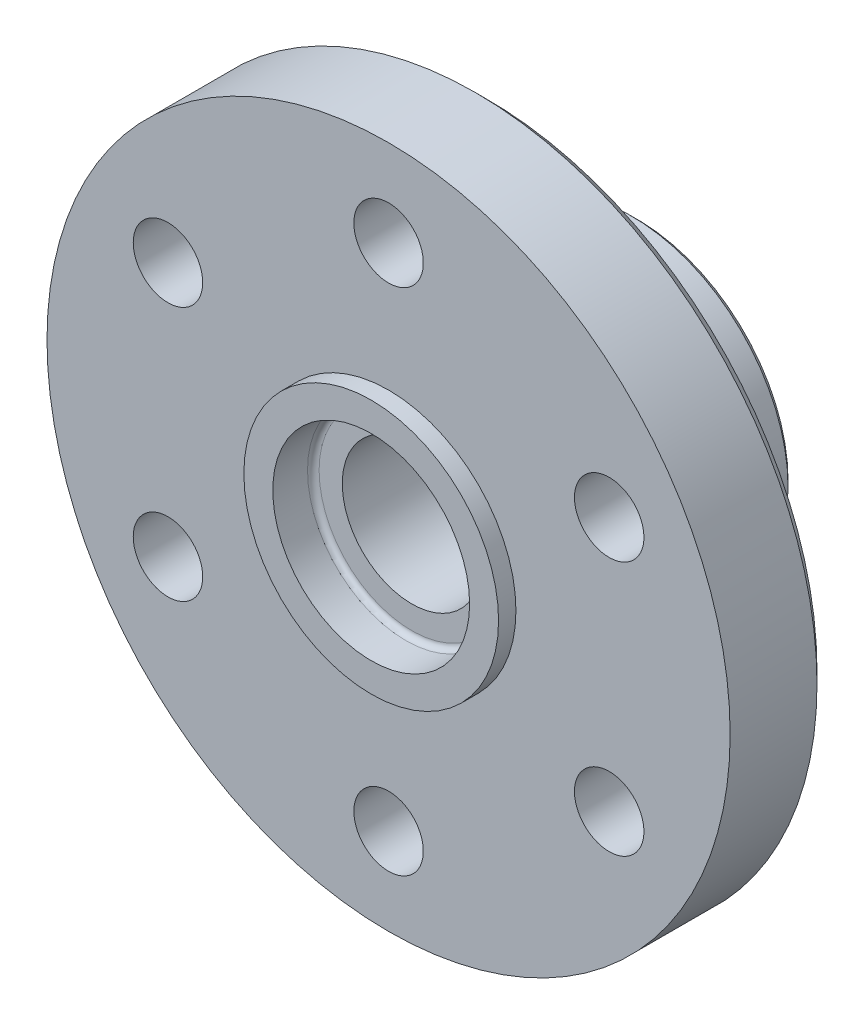
ISO-10303-21;
HEADER;
FILE_DESCRIPTION(('STEP AP214'),'2;1');
FILE_NAME('part.step','',(''),(''),'','','');
FILE_SCHEMA(('AUTOMOTIVE_DESIGN { 1 0 10303 214 1 1 1 1 }'));
ENDSEC;
DATA;
#1=APPLICATION_CONTEXT('core data for automotive mechanical design processes');
#2=APPLICATION_PROTOCOL_DEFINITION('international standard','automotive_design',2000,#1);
#3=PRODUCT_CONTEXT('',#1,'mechanical');
#4=PRODUCT('Part','Part','',(#3));
#5=PRODUCT_RELATED_PRODUCT_CATEGORY('part','',(#4));
#6=PRODUCT_DEFINITION_FORMATION('','',#4);
#7=PRODUCT_DEFINITION_CONTEXT('part definition',#1,'design');
#8=PRODUCT_DEFINITION('design','',#6,#7);
#9=PRODUCT_DEFINITION_SHAPE('','',#8);
#10=(LENGTH_UNIT() NAMED_UNIT(*) SI_UNIT(.MILLI.,.METRE.));
#11=(NAMED_UNIT(*) PLANE_ANGLE_UNIT() SI_UNIT($,.RADIAN.));
#12=(NAMED_UNIT(*) SI_UNIT($,.STERADIAN.) SOLID_ANGLE_UNIT());
#13=UNCERTAINTY_MEASURE_WITH_UNIT(LENGTH_MEASURE(1.E-05),#10,'distance_accuracy_value','');
#14=(GEOMETRIC_REPRESENTATION_CONTEXT(3) GLOBAL_UNCERTAINTY_ASSIGNED_CONTEXT((#13)) GLOBAL_UNIT_ASSIGNED_CONTEXT((#10,
#11,#12)) REPRESENTATION_CONTEXT('',''));
#15=CARTESIAN_POINT('',(0.,0.,0.));
#16=DIRECTION('',(0.,0.,1.));
#17=DIRECTION('',(1.,0.,0.));
#18=AXIS2_PLACEMENT_3D('',#15,#16,#17);
#19=CARTESIAN_POINT('',(0.,0.,9.0012233726392));
#20=DIRECTION('',(0.,0.,1.));
#21=DIRECTION('',(1.,0.,0.));
#22=AXIS2_PLACEMENT_3D('',#19,#20,#21);
#23=CYLINDRICAL_SURFACE('',#22,17.);
#24=CARTESIAN_POINT('',(0.,0.,8.20891792379293));
#25=DIRECTION('',(0.,0.,-1.));
#26=DIRECTION('',(-1.,0.,0.));
#27=AXIS2_PLACEMENT_3D('',#24,#25,#26);
#28=CIRCLE('',#27,17.);
#29=CARTESIAN_POINT('',(-17.,0.,8.20891792379293));
#30=VERTEX_POINT('',#29);
#31=EDGE_CURVE('E66',#30,#30,#28,.T.);
#32=ORIENTED_EDGE('',*,*,#31,.T.);
#33=EDGE_LOOP('',(#32));
#34=FACE_BOUND('',#33,.T.);
#35=CARTESIAN_POINT('',(0.,0.,14.2089179237929));
#36=DIRECTION('',(0.,0.,1.));
#37=DIRECTION('',(1.,0.,0.));
#38=AXIS2_PLACEMENT_3D('',#35,#36,#37);
#39=CIRCLE('',#38,17.);
#40=CARTESIAN_POINT('',(17.,0.,14.2089179237929));
#41=VERTEX_POINT('',#40);
#42=EDGE_CURVE('E78',#41,#41,#39,.T.);
#43=ORIENTED_EDGE('',*,*,#42,.T.);
#44=EDGE_LOOP('',(#43));
#45=FACE_BOUND('',#44,.T.);
#46=ADVANCED_FACE('F39',(#34,#45),#23,.F.);
#47=CARTESIAN_POINT('',(0.,22.,14.2089179237929));
#48=DIRECTION('',(0.,0.,-1.));
#49=DIRECTION('',(-1.,0.,0.));
#50=AXIS2_PLACEMENT_3D('',#47,#48,#49);
#51=PLANE('',#50);
#52=ORIENTED_EDGE('',*,*,#42,.F.);
#53=EDGE_LOOP('',(#52));
#54=FACE_BOUND('',#53,.T.);
#55=CARTESIAN_POINT('',(0.,0.,14.2089179237929));
#56=DIRECTION('',(0.,0.,1.));
#57=DIRECTION('',(1.,0.,0.));
#58=AXIS2_PLACEMENT_3D('',#55,#56,#57);
#59=CIRCLE('',#58,22.);
#60=CARTESIAN_POINT('',(22.,0.,14.2089179237929));
#61=VERTEX_POINT('',#60);
#62=EDGE_CURVE('E81',#61,#61,#59,.T.);
#63=ORIENTED_EDGE('',*,*,#62,.T.);
#64=EDGE_LOOP('',(#63));
#65=FACE_BOUND('',#64,.T.);
#66=ADVANCED_FACE('F166',(#54,#65),#51,.F.);
#67=CARTESIAN_POINT('',(0.,0.,9.0012233726392));
#68=DIRECTION('',(0.,0.,1.));
#69=DIRECTION('',(1.,0.,0.));
#70=AXIS2_PLACEMENT_3D('',#67,#68,#69);
#71=CYLINDRICAL_SURFACE('',#70,22.);
#72=ORIENTED_EDGE('',*,*,#62,.F.);
#73=EDGE_LOOP('',(#72));
#74=FACE_BOUND('',#73,.T.);
#75=CARTESIAN_POINT('',(0.,0.,11.2089179237929));
#76=DIRECTION('',(0.,0.,1.));
#77=DIRECTION('',(1.,0.,0.));
#78=AXIS2_PLACEMENT_3D('',#75,#76,#77);
#79=CIRCLE('',#78,22.);
#80=CARTESIAN_POINT('',(22.,0.,11.2089179237929));
#81=VERTEX_POINT('',#80);
#82=EDGE_CURVE('E84',#81,#81,#79,.T.);
#83=ORIENTED_EDGE('',*,*,#82,.T.);
#84=EDGE_LOOP('',(#83));
#85=FACE_BOUND('',#84,.T.);
#86=ADVANCED_FACE('F154',(#74,#85),#71,.T.);
#87=CARTESIAN_POINT('',(0.,22.,11.2089179237929));
#88=DIRECTION('',(0.,0.,-1.));
#89=DIRECTION('',(-1.,0.,0.));
#90=AXIS2_PLACEMENT_3D('',#87,#88,#89);
#91=PLANE('',#90);
#92=CARTESIAN_POINT('',(38.105117766515,22.0000000000004,11.2089179237929));
#93=DIRECTION('',(0.,0.,-1.));
#94=DIRECTION('',(-1.,0.,0.));
#95=AXIS2_PLACEMENT_3D('',#92,#93,#94);
#96=CIRCLE('',#95,6.);
#97=CARTESIAN_POINT('',(32.105117766515,22.0000000000004,11.2089179237929));
#98=VERTEX_POINT('',#97);
#99=EDGE_CURVE('E106',#98,#98,#96,.F.);
#100=ORIENTED_EDGE('',*,*,#99,.F.);
#101=EDGE_LOOP('',(#100));
#102=FACE_BOUND('',#101,.T.);
#103=CARTESIAN_POINT('',(38.1051177665155,-21.9999999999996,11.2089179237929));
#104=DIRECTION('',(0.,0.,-1.));
#105=DIRECTION('',(-1.,0.,0.));
#106=AXIS2_PLACEMENT_3D('',#103,#104,#105);
#107=CIRCLE('',#106,6.);
#108=CARTESIAN_POINT('',(32.1051177665155,-21.9999999999996,11.2089179237929));
#109=VERTEX_POINT('',#108);
#110=EDGE_CURVE('E113',#109,#109,#107,.F.);
#111=ORIENTED_EDGE('',*,*,#110,.F.);
#112=EDGE_LOOP('',(#111));
#113=FACE_BOUND('',#112,.T.);
#114=CARTESIAN_POINT('',(0.,-44.,11.2089179237929));
#115=DIRECTION('',(0.,0.,-1.));
#116=DIRECTION('',(-1.,0.,0.));
#117=AXIS2_PLACEMENT_3D('',#114,#115,#116);
#118=CIRCLE('',#117,6.);
#119=CARTESIAN_POINT('',(-6.,-44.,11.2089179237929));
#120=VERTEX_POINT('',#119);
#121=EDGE_CURVE('E119',#120,#120,#118,.F.);
#122=ORIENTED_EDGE('',*,*,#121,.F.);
#123=EDGE_LOOP('',(#122));
#124=FACE_BOUND('',#123,.T.);
#125=CARTESIAN_POINT('',(-38.1051177665152,-22.0000000000002,11.2089179237929));
#126=DIRECTION('',(0.,0.,-1.));
#127=DIRECTION('',(-1.,0.,0.));
#128=AXIS2_PLACEMENT_3D('',#125,#126,#127);
#129=CIRCLE('',#128,6.);
#130=CARTESIAN_POINT('',(-44.1051177665152,-22.0000000000002,11.2089179237929));
#131=VERTEX_POINT('',#130);
#132=EDGE_CURVE('E105',#131,#131,#129,.F.);
#133=ORIENTED_EDGE('',*,*,#132,.F.);
#134=EDGE_LOOP('',(#133));
#135=FACE_BOUND('',#134,.T.);
#136=CARTESIAN_POINT('',(-38.1051177665153,21.9999999999999,11.2089179237929));
#137=DIRECTION('',(0.,0.,-1.));
#138=DIRECTION('',(-1.,0.,0.));
#139=AXIS2_PLACEMENT_3D('',#136,#137,#138);
#140=CIRCLE('',#139,6.);
#141=CARTESIAN_POINT('',(-44.1051177665153,21.9999999999999,11.2089179237929));
#142=VERTEX_POINT('',#141);
#143=EDGE_CURVE('E99',#142,#142,#140,.F.);
#144=ORIENTED_EDGE('',*,*,#143,.F.);
#145=EDGE_LOOP('',(#144));
#146=FACE_BOUND('',#145,.T.);
#147=CARTESIAN_POINT('',(0.,44.,11.2089179237929));
#148=DIRECTION('',(0.,0.,-1.));
#149=DIRECTION('',(-1.,0.,0.));
#150=AXIS2_PLACEMENT_3D('',#147,#148,#149);
#151=CIRCLE('',#150,6.);
#152=CARTESIAN_POINT('',(-6.,44.,11.2089179237929));
#153=VERTEX_POINT('',#152);
#154=EDGE_CURVE('E93',#153,#153,#151,.F.);
#155=ORIENTED_EDGE('',*,*,#154,.F.);
#156=EDGE_LOOP('',(#155));
#157=FACE_BOUND('',#156,.T.);
#158=ORIENTED_EDGE('',*,*,#82,.F.);
#159=EDGE_LOOP('',(#158));
#160=FACE_BOUND('',#159,.T.);
#161=CARTESIAN_POINT('',(0.,0.,11.2089179237929));
#162=DIRECTION('',(0.,0.,1.));
#163=DIRECTION('',(1.,0.,0.));
#164=AXIS2_PLACEMENT_3D('',#161,#162,#163);
#165=CIRCLE('',#164,59.);
#166=CARTESIAN_POINT('',(59.,0.,11.2089179237929));
#167=VERTEX_POINT('',#166);
#168=EDGE_CURVE('E87',#167,#167,#165,.T.);
#169=ORIENTED_EDGE('',*,*,#168,.T.);
#170=EDGE_LOOP('',(#169));
#171=FACE_BOUND('',#170,.T.);
#172=ADVANCED_FACE('F151',(#102,#113,#124,#135,#146,#157,#160,#171),#91,.F.);
#173=CARTESIAN_POINT('',(0.,0.,9.0012233726392));
#174=DIRECTION('',(0.,0.,1.));
#175=DIRECTION('',(1.,0.,0.));
#176=AXIS2_PLACEMENT_3D('',#173,#174,#175);
#177=CYLINDRICAL_SURFACE('',#176,59.);
#178=CARTESIAN_POINT('',(0.,0.,-3.79108207620708));
#179=DIRECTION('',(0.,0.,1.));
#180=DIRECTION('',(1.,0.,0.));
#181=AXIS2_PLACEMENT_3D('',#178,#179,#180);
#182=CIRCLE('',#181,59.);
#183=CARTESIAN_POINT('',(59.,0.,-3.79108207620708));
#184=VERTEX_POINT('',#183);
#185=EDGE_CURVE('E47',#184,#184,#182,.T.);
#186=ORIENTED_EDGE('',*,*,#185,.T.);
#187=EDGE_LOOP('',(#186));
#188=FACE_BOUND('',#187,.T.);
#189=ORIENTED_EDGE('',*,*,#168,.F.);
#190=EDGE_LOOP('',(#189));
#191=FACE_BOUND('',#190,.T.);
#192=ADVANCED_FACE('F137',(#188,#191),#177,.T.);
#193=CARTESIAN_POINT('',(0.,59.,-5.79108207620707));
#194=DIRECTION('',(0.,0.,1.));
#195=DIRECTION('',(1.,0.,0.));
#196=AXIS2_PLACEMENT_3D('',#193,#194,#195);
#197=PLANE('',#196);
#198=CARTESIAN_POINT('',(0.,0.,-5.79108207620707));
#199=DIRECTION('',(0.,0.,1.));
#200=DIRECTION('',(1.,0.,0.));
#201=AXIS2_PLACEMENT_3D('',#198,#199,#200);
#202=CIRCLE('',#201,57.);
#203=CARTESIAN_POINT('',(57.,0.,-5.79108207620707));
#204=VERTEX_POINT('',#203);
#205=EDGE_CURVE('E10',#204,#204,#202,.F.);
#206=ORIENTED_EDGE('',*,*,#205,.T.);
#207=EDGE_LOOP('',(#206));
#208=FACE_BOUND('',#207,.T.);
#209=CARTESIAN_POINT('',(0.,0.,-5.79108207620707));
#210=DIRECTION('',(0.,0.,1.));
#211=DIRECTION('',(1.,0.,0.));
#212=AXIS2_PLACEMENT_3D('',#209,#210,#211);
#213=CIRCLE('',#212,29.);
#214=CARTESIAN_POINT('',(29.,0.,-5.79108207620707));
#215=VERTEX_POINT('',#214);
#216=EDGE_CURVE('E75',#215,#215,#213,.T.);
#217=ORIENTED_EDGE('',*,*,#216,.T.);
#218=EDGE_LOOP('',(#217));
#219=FACE_BOUND('',#218,.T.);
#220=CARTESIAN_POINT('',(38.105117766515,22.0000000000004,-5.79108207620707));
#221=DIRECTION('',(0.,0.,-1.));
#222=DIRECTION('',(-0.50000000000001,0.866025403784433,0.));
#223=AXIS2_PLACEMENT_3D('',#220,#221,#222);
#224=CIRCLE('',#223,6.);
#225=CARTESIAN_POINT('',(35.105117766515,27.196152422707,-5.79108207620707));
#226=VERTEX_POINT('',#225);
#227=EDGE_CURVE('E110',#226,#226,#224,.T.);
#228=ORIENTED_EDGE('',*,*,#227,.F.);
#229=EDGE_LOOP('',(#228));
#230=FACE_BOUND('',#229,.T.);
#231=CARTESIAN_POINT('',(38.1051177665155,-21.9999999999996,-5.79108207620707));
#232=DIRECTION('',(0.,0.,-1.));
#233=DIRECTION('',(0.499999999999992,0.866025403784443,0.));
#234=AXIS2_PLACEMENT_3D('',#231,#232,#233);
#235=CIRCLE('',#234,6.);
#236=CARTESIAN_POINT('',(41.1051177665154,-16.803847577293,-5.79108207620707));
#237=VERTEX_POINT('',#236);
#238=EDGE_CURVE('E109',#237,#237,#235,.T.);
#239=ORIENTED_EDGE('',*,*,#238,.F.);
#240=EDGE_LOOP('',(#239));
#241=FACE_BOUND('',#240,.T.);
#242=CARTESIAN_POINT('',(0.,-44.,-5.79108207620707));
#243=DIRECTION('',(0.,0.,-1.));
#244=DIRECTION('',(1.,0.,0.));
#245=AXIS2_PLACEMENT_3D('',#242,#243,#244);
#246=CIRCLE('',#245,6.);
#247=CARTESIAN_POINT('',(6.,-44.,-5.79108207620707));
#248=VERTEX_POINT('',#247);
#249=EDGE_CURVE('E116',#248,#248,#246,.T.);
#250=ORIENTED_EDGE('',*,*,#249,.F.);
#251=EDGE_LOOP('',(#250));
#252=FACE_BOUND('',#251,.T.);
#253=CARTESIAN_POINT('',(-38.1051177665152,-22.0000000000002,-5.79108207620707));
#254=DIRECTION('',(0.,0.,-1.));
#255=DIRECTION('',(0.500000000000004,-0.866025403784436,0.));
#256=AXIS2_PLACEMENT_3D('',#253,#254,#255);
#257=CIRCLE('',#256,6.);
#258=CARTESIAN_POINT('',(-35.1051177665152,-27.1961524227068,-5.79108207620707));
#259=VERTEX_POINT('',#258);
#260=EDGE_CURVE('E122',#259,#259,#257,.T.);
#261=ORIENTED_EDGE('',*,*,#260,.F.);
#262=EDGE_LOOP('',(#261));
#263=FACE_BOUND('',#262,.T.);
#264=CARTESIAN_POINT('',(-38.1051177665153,21.9999999999999,-5.79108207620707));
#265=DIRECTION('',(0.,0.,-1.));
#266=DIRECTION('',(-0.499999999999998,-0.86602540378444,0.));
#267=AXIS2_PLACEMENT_3D('',#264,#265,#266);
#268=CIRCLE('',#267,6.);
#269=CARTESIAN_POINT('',(-41.1051177665153,16.8038475772933,-5.79108207620707));
#270=VERTEX_POINT('',#269);
#271=EDGE_CURVE('E102',#270,#270,#268,.T.);
#272=ORIENTED_EDGE('',*,*,#271,.F.);
#273=EDGE_LOOP('',(#272));
#274=FACE_BOUND('',#273,.T.);
#275=CARTESIAN_POINT('',(0.,44.,-5.79108207620707));
#276=DIRECTION('',(0.,0.,-1.));
#277=DIRECTION('',(-1.,0.,0.));
#278=AXIS2_PLACEMENT_3D('',#275,#276,#277);
#279=CIRCLE('',#278,6.);
#280=CARTESIAN_POINT('',(-6.,44.,-5.79108207620707));
#281=VERTEX_POINT('',#280);
#282=EDGE_CURVE('E96',#281,#281,#279,.T.);
#283=ORIENTED_EDGE('',*,*,#282,.F.);
#284=EDGE_LOOP('',(#283));
#285=FACE_BOUND('',#284,.T.);
#286=ADVANCED_FACE('F133',(#208,#219,#230,#241,#252,#263,#274,#285),#197,.F.);
#287=CARTESIAN_POINT('',(0.,0.,9.0012233726392));
#288=DIRECTION('',(0.,0.,1.));
#289=DIRECTION('',(1.,0.,0.));
#290=AXIS2_PLACEMENT_3D('',#287,#288,#289);
#291=CYLINDRICAL_SURFACE('',#290,27.);
#292=CARTESIAN_POINT('',(0.,0.,-30.7910820762071));
#293=DIRECTION('',(0.,0.,1.));
#294=DIRECTION('',(1.,0.,0.));
#295=AXIS2_PLACEMENT_3D('',#292,#293,#294);
#296=CIRCLE('',#295,27.);
#297=CARTESIAN_POINT('',(27.,0.,-30.7910820762071));
#298=VERTEX_POINT('',#297);
#299=EDGE_CURVE('E51',#298,#298,#296,.T.);
#300=ORIENTED_EDGE('',*,*,#299,.T.);
#301=EDGE_LOOP('',(#300));
#302=FACE_BOUND('',#301,.T.);
#303=CARTESIAN_POINT('',(0.,0.,-7.79108207620707));
#304=DIRECTION('',(0.,0.,1.));
#305=DIRECTION('',(1.,0.,0.));
#306=AXIS2_PLACEMENT_3D('',#303,#304,#305);
#307=CIRCLE('',#306,27.);
#308=CARTESIAN_POINT('',(27.,0.,-7.79108207620707));
#309=VERTEX_POINT('',#308);
#310=EDGE_CURVE('E72',#309,#309,#307,.F.);
#311=ORIENTED_EDGE('',*,*,#310,.T.);
#312=EDGE_LOOP('',(#311));
#313=FACE_BOUND('',#312,.T.);
#314=ADVANCED_FACE('F136',(#302,#313),#291,.T.);
#315=CARTESIAN_POINT('',(0.,27.,-31.7910820762071));
#316=DIRECTION('',(0.,0.,1.));
#317=DIRECTION('',(1.,0.,0.));
#318=AXIS2_PLACEMENT_3D('',#315,#316,#317);
#319=PLANE('',#318);
#320=CARTESIAN_POINT('',(0.,0.,-31.7910820762071));
#321=DIRECTION('',(0.,0.,1.));
#322=DIRECTION('',(1.,0.,0.));
#323=AXIS2_PLACEMENT_3D('',#320,#321,#322);
#324=CIRCLE('',#323,13.);
#325=CARTESIAN_POINT('',(13.,0.,-31.7910820762071));
#326=VERTEX_POINT('',#325);
#327=EDGE_CURVE('E60',#326,#326,#324,.T.);
#328=ORIENTED_EDGE('',*,*,#327,.T.);
#329=EDGE_LOOP('',(#328));
#330=FACE_BOUND('',#329,.T.);
#331=CARTESIAN_POINT('',(0.,0.,-31.7910820762071));
#332=DIRECTION('',(0.,0.,1.));
#333=DIRECTION('',(1.,0.,0.));
#334=AXIS2_PLACEMENT_3D('',#331,#332,#333);
#335=CIRCLE('',#334,26.);
#336=CARTESIAN_POINT('',(26.,0.,-31.7910820762071));
#337=VERTEX_POINT('',#336);
#338=EDGE_CURVE('E63',#337,#337,#335,.F.);
#339=ORIENTED_EDGE('',*,*,#338,.T.);
#340=EDGE_LOOP('',(#339));
#341=FACE_BOUND('',#340,.T.);
#342=ADVANCED_FACE('F208',(#330,#341),#319,.F.);
#343=CARTESIAN_POINT('',(0.,0.,9.0012233726392));
#344=DIRECTION('',(0.,0.,1.));
#345=DIRECTION('',(1.,0.,0.));
#346=AXIS2_PLACEMENT_3D('',#343,#344,#345);
#347=CYLINDRICAL_SURFACE('',#346,12.);
#348=CARTESIAN_POINT('',(0.,0.,-30.7910820762071));
#349=DIRECTION('',(0.,0.,1.));
#350=DIRECTION('',(1.,0.,0.));
#351=AXIS2_PLACEMENT_3D('',#348,#349,#350);
#352=CIRCLE('',#351,12.);
#353=CARTESIAN_POINT('',(12.,0.,-30.7910820762071));
#354=VERTEX_POINT('',#353);
#355=EDGE_CURVE('E55',#354,#354,#352,.F.);
#356=ORIENTED_EDGE('',*,*,#355,.T.);
#357=EDGE_LOOP('',(#356));
#358=FACE_BOUND('',#357,.T.);
#359=CARTESIAN_POINT('',(0.,0.,7.20891792379293));
#360=DIRECTION('',(0.,0.,1.));
#361=DIRECTION('',(1.,0.,0.));
#362=AXIS2_PLACEMENT_3D('',#359,#360,#361);
#363=CIRCLE('',#362,12.);
#364=CARTESIAN_POINT('',(12.,0.,7.20891792379293));
#365=VERTEX_POINT('',#364);
#366=EDGE_CURVE('E90',#365,#365,#363,.T.);
#367=ORIENTED_EDGE('',*,*,#366,.T.);
#368=EDGE_LOOP('',(#367));
#369=FACE_BOUND('',#368,.T.);
#370=ADVANCED_FACE('F245',(#358,#369),#347,.F.);
#371=CARTESIAN_POINT('',(0.,17.,7.20891792379293));
#372=DIRECTION('',(0.,0.,-1.));
#373=DIRECTION('',(-1.,0.,0.));
#374=AXIS2_PLACEMENT_3D('',#371,#372,#373);
#375=PLANE('',#374);
#376=CARTESIAN_POINT('',(0.,0.,7.20891792379293));
#377=DIRECTION('',(0.,0.,-1.));
#378=DIRECTION('',(-1.,0.,0.));
#379=AXIS2_PLACEMENT_3D('',#376,#377,#378);
#380=CIRCLE('',#379,16.);
#381=CARTESIAN_POINT('',(-16.,0.,7.20891792379293));
#382=VERTEX_POINT('',#381);
#383=EDGE_CURVE('E69',#382,#382,#380,.F.);
#384=ORIENTED_EDGE('',*,*,#383,.T.);
#385=EDGE_LOOP('',(#384));
#386=FACE_BOUND('',#385,.T.);
#387=ORIENTED_EDGE('',*,*,#366,.F.);
#388=EDGE_LOOP('',(#387));
#389=FACE_BOUND('',#388,.T.);
#390=ADVANCED_FACE('F147',(#386,#389),#375,.F.);
#391=CARTESIAN_POINT('',(0.,44.,14.2099179237929));
#392=DIRECTION('',(0.,0.,-1.));
#393=DIRECTION('',(-1.,0.,0.));
#394=AXIS2_PLACEMENT_3D('',#391,#392,#393);
#395=CYLINDRICAL_SURFACE('',#394,6.);
#396=ORIENTED_EDGE('',*,*,#282,.T.);
#397=EDGE_LOOP('',(#396));
#398=FACE_BOUND('',#397,.T.);
#399=ORIENTED_EDGE('',*,*,#154,.T.);
#400=EDGE_LOOP('',(#399));
#401=FACE_BOUND('',#400,.T.);
#402=ADVANCED_FACE('F143',(#398,#401),#395,.F.);
#403=CARTESIAN_POINT('',(-38.1051177665153,21.9999999999999,14.2099179237929));
#404=DIRECTION('',(0.,0.,-1.));
#405=DIRECTION('',(-1.,0.,0.));
#406=AXIS2_PLACEMENT_3D('',#403,#404,#405);
#407=CYLINDRICAL_SURFACE('',#406,6.);
#408=ORIENTED_EDGE('',*,*,#271,.T.);
#409=EDGE_LOOP('',(#408));
#410=FACE_BOUND('',#409,.T.);
#411=ORIENTED_EDGE('',*,*,#143,.T.);
#412=EDGE_LOOP('',(#411));
#413=FACE_BOUND('',#412,.T.);
#414=ADVANCED_FACE('F146',(#410,#413),#407,.F.);
#415=CARTESIAN_POINT('',(-38.1051177665152,-22.0000000000002,14.2099179237929));
#416=DIRECTION('',(0.,0.,-1.));
#417=DIRECTION('',(-1.,0.,0.));
#418=AXIS2_PLACEMENT_3D('',#415,#416,#417);
#419=CYLINDRICAL_SURFACE('',#418,6.);
#420=ORIENTED_EDGE('',*,*,#260,.T.);
#421=EDGE_LOOP('',(#420));
#422=FACE_BOUND('',#421,.T.);
#423=ORIENTED_EDGE('',*,*,#132,.T.);
#424=EDGE_LOOP('',(#423));
#425=FACE_BOUND('',#424,.T.);
#426=ADVANCED_FACE('F130',(#422,#425),#419,.F.);
#427=CARTESIAN_POINT('',(0.,-44.,14.2099179237929));
#428=DIRECTION('',(0.,0.,-1.));
#429=DIRECTION('',(-1.,0.,0.));
#430=AXIS2_PLACEMENT_3D('',#427,#428,#429);
#431=CYLINDRICAL_SURFACE('',#430,6.);
#432=ORIENTED_EDGE('',*,*,#249,.T.);
#433=EDGE_LOOP('',(#432));
#434=FACE_BOUND('',#433,.T.);
#435=ORIENTED_EDGE('',*,*,#121,.T.);
#436=EDGE_LOOP('',(#435));
#437=FACE_BOUND('',#436,.T.);
#438=ADVANCED_FACE('F221',(#434,#437),#431,.F.);
#439=CARTESIAN_POINT('',(38.1051177665155,-21.9999999999996,14.2099179237929));
#440=DIRECTION('',(0.,0.,-1.));
#441=DIRECTION('',(-1.,0.,0.));
#442=AXIS2_PLACEMENT_3D('',#439,#440,#441);
#443=CYLINDRICAL_SURFACE('',#442,6.);
#444=ORIENTED_EDGE('',*,*,#238,.T.);
#445=EDGE_LOOP('',(#444));
#446=FACE_BOUND('',#445,.T.);
#447=ORIENTED_EDGE('',*,*,#110,.T.);
#448=EDGE_LOOP('',(#447));
#449=FACE_BOUND('',#448,.T.);
#450=ADVANCED_FACE('F224',(#446,#449),#443,.F.);
#451=CARTESIAN_POINT('',(38.105117766515,22.0000000000004,14.2099179237929));
#452=DIRECTION('',(0.,0.,-1.));
#453=DIRECTION('',(-1.,0.,0.));
#454=AXIS2_PLACEMENT_3D('',#451,#452,#453);
#455=CYLINDRICAL_SURFACE('',#454,6.);
#456=ORIENTED_EDGE('',*,*,#227,.T.);
#457=EDGE_LOOP('',(#456));
#458=FACE_BOUND('',#457,.T.);
#459=ORIENTED_EDGE('',*,*,#99,.T.);
#460=EDGE_LOOP('',(#459));
#461=FACE_BOUND('',#460,.T.);
#462=ADVANCED_FACE('F181',(#458,#461),#455,.F.);
#463=CARTESIAN_POINT('',(0.,0.,-7.79108207620707));
#464=DIRECTION('',(0.,0.,1.));
#465=DIRECTION('',(1.,0.,0.));
#466=AXIS2_PLACEMENT_3D('',#463,#464,#465);
#467=TOROIDAL_SURFACE('',#466,29.,2.);
#468=ORIENTED_EDGE('',*,*,#310,.F.);
#469=EDGE_LOOP('',(#468));
#470=FACE_BOUND('',#469,.T.);
#471=ORIENTED_EDGE('',*,*,#216,.F.);
#472=EDGE_LOOP('',(#471));
#473=FACE_BOUND('',#472,.T.);
#474=ADVANCED_FACE('F177',(#470,#473),#467,.F.);
#475=CARTESIAN_POINT('',(0.,0.,8.20891792379293));
#476=DIRECTION('',(0.,0.,-1.));
#477=DIRECTION('',(-1.,0.,0.));
#478=AXIS2_PLACEMENT_3D('',#475,#476,#477);
#479=TOROIDAL_SURFACE('',#478,16.,1.);
#480=ORIENTED_EDGE('',*,*,#31,.F.);
#481=EDGE_LOOP('',(#480));
#482=FACE_BOUND('',#481,.T.);
#483=ORIENTED_EDGE('',*,*,#383,.F.);
#484=EDGE_LOOP('',(#483));
#485=FACE_BOUND('',#484,.T.);
#486=ADVANCED_FACE('F180',(#482,#485),#479,.F.);
#487=CARTESIAN_POINT('',(0.,0.,-31.7910820762071));
#488=DIRECTION('',(0.,0.,-1.));
#489=DIRECTION('',(-1.,0.,0.));
#490=AXIS2_PLACEMENT_3D('',#487,#488,#489);
#491=CONICAL_SURFACE('',#490,13.,0.785398163397449);
#492=ORIENTED_EDGE('',*,*,#355,.F.);
#493=EDGE_LOOP('',(#492));
#494=FACE_BOUND('',#493,.T.);
#495=ORIENTED_EDGE('',*,*,#327,.F.);
#496=EDGE_LOOP('',(#495));
#497=FACE_BOUND('',#496,.T.);
#498=ADVANCED_FACE('F185',(#494,#497),#491,.F.);
#499=CARTESIAN_POINT('',(0.,0.,-30.7910820762071));
#500=DIRECTION('',(0.,0.,1.));
#501=DIRECTION('',(1.,0.,0.));
#502=AXIS2_PLACEMENT_3D('',#499,#500,#501);
#503=CONICAL_SURFACE('',#502,27.,0.785398163397455);
#504=ORIENTED_EDGE('',*,*,#338,.F.);
#505=EDGE_LOOP('',(#504));
#506=FACE_BOUND('',#505,.T.);
#507=ORIENTED_EDGE('',*,*,#299,.F.);
#508=EDGE_LOOP('',(#507));
#509=FACE_BOUND('',#508,.T.);
#510=ADVANCED_FACE('F192',(#506,#509),#503,.T.);
#511=CARTESIAN_POINT('',(0.,0.,-3.79108207620708));
#512=DIRECTION('',(0.,0.,1.));
#513=DIRECTION('',(1.,0.,0.));
#514=AXIS2_PLACEMENT_3D('',#511,#512,#513);
#515=CONICAL_SURFACE('',#514,59.,0.785398163397452);
#516=ORIENTED_EDGE('',*,*,#205,.F.);
#517=EDGE_LOOP('',(#516));
#518=FACE_BOUND('',#517,.T.);
#519=ORIENTED_EDGE('',*,*,#185,.F.);
#520=EDGE_LOOP('',(#519));
#521=FACE_BOUND('',#520,.T.);
#522=ADVANCED_FACE('F42',(#518,#521),#515,.T.);
#523=CLOSED_SHELL('',(#46,#66,#86,#172,#192,#286,#314,#342,#370,#390,#402,#414,#426,#438,#450,
#462,#474,#486,#498,#510,#522));
#524=MANIFOLD_SOLID_BREP('B2',#523);
#525=ADVANCED_BREP_SHAPE_REPRESENTATION('',(#18,#524),#14);
#526=SHAPE_DEFINITION_REPRESENTATION(#9,#525);
ENDSEC;
END-ISO-10303-21;
